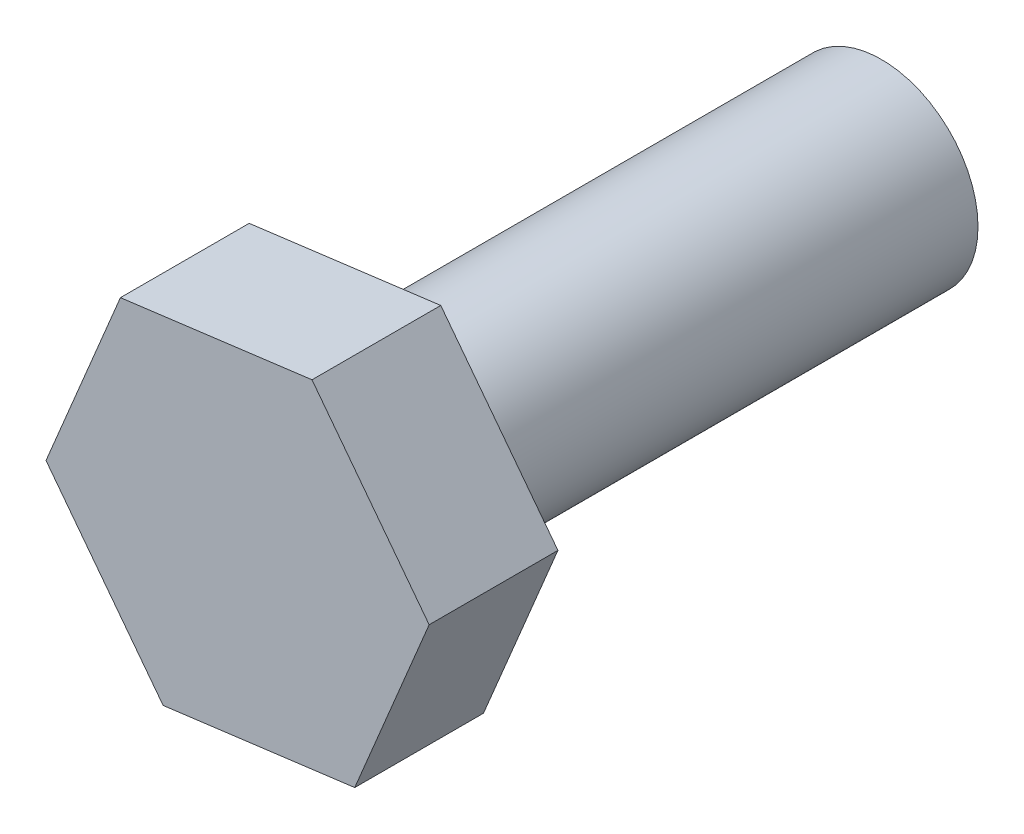
ISO-10303-21;
HEADER;
FILE_DESCRIPTION(('STEP AP214'),'2;1');
FILE_NAME('part.step','',(''),(''),'','','');
FILE_SCHEMA(('AUTOMOTIVE_DESIGN { 1 0 10303 214 1 1 1 1 }'));
ENDSEC;
DATA;
#1=APPLICATION_CONTEXT('core data for automotive mechanical design processes');
#2=APPLICATION_PROTOCOL_DEFINITION('international standard','automotive_design',2000,#1);
#3=PRODUCT_CONTEXT('',#1,'mechanical');
#4=PRODUCT('Part','Part','',(#3));
#5=PRODUCT_RELATED_PRODUCT_CATEGORY('part','',(#4));
#6=PRODUCT_DEFINITION_FORMATION('','',#4);
#7=PRODUCT_DEFINITION_CONTEXT('part definition',#1,'design');
#8=PRODUCT_DEFINITION('design','',#6,#7);
#9=PRODUCT_DEFINITION_SHAPE('','',#8);
#10=(LENGTH_UNIT() NAMED_UNIT(*) SI_UNIT(.MILLI.,.METRE.));
#11=(NAMED_UNIT(*) PLANE_ANGLE_UNIT() SI_UNIT($,.RADIAN.));
#12=(NAMED_UNIT(*) SI_UNIT($,.STERADIAN.) SOLID_ANGLE_UNIT());
#13=UNCERTAINTY_MEASURE_WITH_UNIT(LENGTH_MEASURE(1.E-05),#10,'distance_accuracy_value','');
#14=(GEOMETRIC_REPRESENTATION_CONTEXT(3) GLOBAL_UNCERTAINTY_ASSIGNED_CONTEXT((#13)) GLOBAL_UNIT_ASSIGNED_CONTEXT((#10,
#11,#12)) REPRESENTATION_CONTEXT('',''));
#15=CARTESIAN_POINT('',(0.,0.,0.));
#16=DIRECTION('',(0.,0.,1.));
#17=DIRECTION('',(1.,0.,0.));
#18=AXIS2_PLACEMENT_3D('',#15,#16,#17);
#19=CARTESIAN_POINT('',(0.,0.,-12.7));
#20=DIRECTION('',(0.,0.,1.));
#21=DIRECTION('',(1.,0.,0.));
#22=AXIS2_PLACEMENT_3D('',#19,#20,#21);
#23=CYLINDRICAL_SURFACE('',#22,2.38125);
#24=CARTESIAN_POINT('',(0.,0.,-12.7));
#25=DIRECTION('',(0.,0.,1.));
#26=DIRECTION('',(1.,0.,0.));
#27=AXIS2_PLACEMENT_3D('',#24,#25,#26);
#28=CIRCLE('',#27,2.38125);
#29=CARTESIAN_POINT('',(2.38125,0.,-12.7));
#30=VERTEX_POINT('',#29);
#31=EDGE_CURVE('E11',#30,#30,#28,.T.);
#32=ORIENTED_EDGE('',*,*,#31,.T.);
#33=EDGE_LOOP('',(#32));
#34=FACE_BOUND('',#33,.T.);
#35=CARTESIAN_POINT('',(0.,0.,0.));
#36=DIRECTION('',(0.,0.,1.));
#37=DIRECTION('',(1.,0.,0.));
#38=AXIS2_PLACEMENT_3D('',#35,#36,#37);
#39=CIRCLE('',#38,2.38125);
#40=CARTESIAN_POINT('',(2.38125,0.,0.));
#41=VERTEX_POINT('',#40);
#42=EDGE_CURVE('E36',#41,#41,#39,.T.);
#43=ORIENTED_EDGE('',*,*,#42,.F.);
#44=EDGE_LOOP('',(#43));
#45=FACE_BOUND('',#44,.T.);
#46=ADVANCED_FACE('F33',(#34,#45),#23,.T.);
#47=CARTESIAN_POINT('',(0.,0.,-12.7));
#48=DIRECTION('',(0.,0.,1.));
#49=DIRECTION('',(1.,0.,0.));
#50=AXIS2_PLACEMENT_3D('',#47,#48,#49);
#51=PLANE('',#50);
#52=ORIENTED_EDGE('',*,*,#31,.F.);
#53=EDGE_LOOP('',(#52));
#54=FACE_BOUND('',#53,.T.);
#55=ADVANCED_FACE('F144',(#54),#51,.F.);
#56=CARTESIAN_POINT('',(4.72351218179401,0.608143830391773,3.175));
#57=DIRECTION('',(-0.795088636078318,-0.606493248749828,0.));
#58=DIRECTION('',(0.606493248749828,-0.795088636078318,0.));
#59=AXIS2_PLACEMENT_3D('',#56,#57,#58);
#60=PLANE('',#59);
#61=DIRECTION('',(-0.606493248749828,0.795088636078318,0.));
#62=VECTOR('',#61,1.);
#63=CARTESIAN_POINT('',(4.72351218179401,0.608143830391773,0.));
#64=LINE('',#63,#62);
#65=CARTESIAN_POINT('',(4.72351218179401,0.608143830391773,0.));
#66=VERTEX_POINT('',#65);
#67=CARTESIAN_POINT('',(1.83508808462296,4.39475345971476,0.));
#68=VERTEX_POINT('',#67);
#69=EDGE_CURVE('E118',#66,#68,#64,.T.);
#70=ORIENTED_EDGE('',*,*,#69,.T.);
#71=DIRECTION('',(0.,0.,-1.));
#72=VECTOR('',#71,1.);
#73=CARTESIAN_POINT('',(1.83508808462296,4.39475345971476,3.175));
#74=LINE('',#73,#72);
#75=CARTESIAN_POINT('',(1.83508808462296,4.39475345971476,3.175));
#76=VERTEX_POINT('',#75);
#77=EDGE_CURVE('E135',#76,#68,#74,.T.);
#78=ORIENTED_EDGE('',*,*,#77,.F.);
#79=DIRECTION('',(-0.606493248749828,0.795088636078318,0.));
#80=VECTOR('',#79,1.);
#81=CARTESIAN_POINT('',(4.72351218179401,0.608143830391773,3.175));
#82=LINE('',#81,#80);
#83=CARTESIAN_POINT('',(4.72351218179401,0.608143830391773,3.175));
#84=VERTEX_POINT('',#83);
#85=EDGE_CURVE('E128',#84,#76,#82,.T.);
#86=ORIENTED_EDGE('',*,*,#85,.F.);
#87=DIRECTION('',(0.,0.,-1.));
#88=VECTOR('',#87,1.);
#89=CARTESIAN_POINT('',(4.72351218179401,0.608143830391773,3.175));
#90=LINE('',#89,#88);
#91=EDGE_CURVE('E114',#84,#66,#90,.T.);
#92=ORIENTED_EDGE('',*,*,#91,.T.);
#93=EDGE_LOOP('',(#70,#78,#86,#92));
#94=FACE_BOUND('',#93,.T.);
#95=ADVANCED_FACE('F149',(#94),#60,.F.);
#96=CARTESIAN_POINT('',(1.83508808462296,4.39475345971476,3.175));
#97=DIRECTION('',(0.127694242601947,-0.991813581479058,0.));
#98=DIRECTION('',(0.991813581479058,0.127694242601947,0.));
#99=AXIS2_PLACEMENT_3D('',#96,#97,#98);
#100=PLANE('',#99);
#101=DIRECTION('',(-0.991813581479058,-0.127694242601947,0.));
#102=VECTOR('',#101,1.);
#103=CARTESIAN_POINT('',(1.83508808462296,4.39475345971476,0.));
#104=LINE('',#103,#102);
#105=CARTESIAN_POINT('',(-2.88842409717106,3.78660962932299,0.));
#106=VERTEX_POINT('',#105);
#107=EDGE_CURVE('E121',#68,#106,#104,.T.);
#108=ORIENTED_EDGE('',*,*,#107,.T.);
#109=DIRECTION('',(0.,0.,-1.));
#110=VECTOR('',#109,1.);
#111=CARTESIAN_POINT('',(-2.88842409717106,3.78660962932299,3.175));
#112=LINE('',#111,#110);
#113=CARTESIAN_POINT('',(-2.88842409717106,3.78660962932299,3.175));
#114=VERTEX_POINT('',#113);
#115=EDGE_CURVE('E132',#114,#106,#112,.T.);
#116=ORIENTED_EDGE('',*,*,#115,.F.);
#117=DIRECTION('',(-0.991813581479058,-0.127694242601947,0.));
#118=VECTOR('',#117,1.);
#119=CARTESIAN_POINT('',(1.83508808462296,4.39475345971476,3.175));
#120=LINE('',#119,#118);
#121=EDGE_CURVE('E87',#76,#114,#120,.T.);
#122=ORIENTED_EDGE('',*,*,#121,.F.);
#123=ORIENTED_EDGE('',*,*,#77,.T.);
#124=EDGE_LOOP('',(#108,#116,#122,#123));
#125=FACE_BOUND('',#124,.T.);
#126=ADVANCED_FACE('F155',(#125),#100,.F.);
#127=CARTESIAN_POINT('',(-2.88842409717106,3.78660962932299,3.175));
#128=DIRECTION('',(0.922782878680265,-0.385320332729229,0.));
#129=DIRECTION('',(0.385320332729229,0.922782878680265,0.));
#130=AXIS2_PLACEMENT_3D('',#127,#128,#129);
#131=PLANE('',#130);
#132=DIRECTION('',(-0.385320332729229,-0.922782878680265,0.));
#133=VECTOR('',#132,1.);
#134=CARTESIAN_POINT('',(-2.88842409717106,3.78660962932299,0.));
#135=LINE('',#134,#133);
#136=CARTESIAN_POINT('',(-4.72351218179401,-0.608143830391774,0.));
#137=VERTEX_POINT('',#136);
#138=EDGE_CURVE('E123',#106,#137,#135,.T.);
#139=ORIENTED_EDGE('',*,*,#138,.T.);
#140=DIRECTION('',(0.,0.,-1.));
#141=VECTOR('',#140,1.);
#142=CARTESIAN_POINT('',(-4.72351218179401,-0.608143830391774,3.175));
#143=LINE('',#142,#141);
#144=CARTESIAN_POINT('',(-4.72351218179401,-0.608143830391774,3.175));
#145=VERTEX_POINT('',#144);
#146=EDGE_CURVE('E109',#145,#137,#143,.T.);
#147=ORIENTED_EDGE('',*,*,#146,.F.);
#148=DIRECTION('',(-0.385320332729229,-0.922782878680265,0.));
#149=VECTOR('',#148,1.);
#150=CARTESIAN_POINT('',(-2.88842409717106,3.78660962932299,3.175));
#151=LINE('',#150,#149);
#152=EDGE_CURVE('E100',#114,#145,#151,.T.);
#153=ORIENTED_EDGE('',*,*,#152,.F.);
#154=ORIENTED_EDGE('',*,*,#115,.T.);
#155=EDGE_LOOP('',(#139,#147,#153,#154));
#156=FACE_BOUND('',#155,.T.);
#157=ADVANCED_FACE('F161',(#156),#131,.F.);
#158=CARTESIAN_POINT('',(-4.72351218179401,-0.608143830391774,3.175));
#159=DIRECTION('',(0.795088636078317,0.606493248749828,0.));
#160=DIRECTION('',(-0.606493248749828,0.795088636078317,0.));
#161=AXIS2_PLACEMENT_3D('',#158,#159,#160);
#162=PLANE('',#161);
#163=DIRECTION('',(0.606493248749828,-0.795088636078317,0.));
#164=VECTOR('',#163,1.);
#165=CARTESIAN_POINT('',(-4.72351218179401,-0.608143830391774,0.));
#166=LINE('',#165,#164);
#167=CARTESIAN_POINT('',(-1.83508808462295,-4.39475345971476,0.));
#168=VERTEX_POINT('',#167);
#169=EDGE_CURVE('E108',#137,#168,#166,.T.);
#170=ORIENTED_EDGE('',*,*,#169,.T.);
#171=DIRECTION('',(0.,0.,-1.));
#172=VECTOR('',#171,1.);
#173=CARTESIAN_POINT('',(-1.83508808462295,-4.39475345971476,3.175));
#174=LINE('',#173,#172);
#175=CARTESIAN_POINT('',(-1.83508808462295,-4.39475345971476,3.175));
#176=VERTEX_POINT('',#175);
#177=EDGE_CURVE('E105',#176,#168,#174,.T.);
#178=ORIENTED_EDGE('',*,*,#177,.F.);
#179=DIRECTION('',(0.606493248749828,-0.795088636078317,0.));
#180=VECTOR('',#179,1.);
#181=CARTESIAN_POINT('',(-4.72351218179401,-0.608143830391774,3.175));
#182=LINE('',#181,#180);
#183=EDGE_CURVE('E94',#145,#176,#182,.T.);
#184=ORIENTED_EDGE('',*,*,#183,.F.);
#185=ORIENTED_EDGE('',*,*,#146,.T.);
#186=EDGE_LOOP('',(#170,#178,#184,#185));
#187=FACE_BOUND('',#186,.T.);
#188=ADVANCED_FACE('F106',(#187),#162,.F.);
#189=CARTESIAN_POINT('',(-1.83508808462295,-4.39475345971476,3.175));
#190=DIRECTION('',(-0.127694242601947,0.991813581479058,0.));
#191=DIRECTION('',(-0.991813581479058,-0.127694242601947,0.));
#192=AXIS2_PLACEMENT_3D('',#189,#190,#191);
#193=PLANE('',#192);
#194=DIRECTION('',(0.991813581479058,0.127694242601947,0.));
#195=VECTOR('',#194,1.);
#196=CARTESIAN_POINT('',(-1.83508808462295,-4.39475345971476,0.));
#197=LINE('',#196,#195);
#198=CARTESIAN_POINT('',(2.88842409717105,-3.78660962932299,0.));
#199=VERTEX_POINT('',#198);
#200=EDGE_CURVE('E72',#168,#199,#197,.T.);
#201=ORIENTED_EDGE('',*,*,#200,.T.);
#202=DIRECTION('',(0.,0.,-1.));
#203=VECTOR('',#202,1.);
#204=CARTESIAN_POINT('',(2.88842409717105,-3.78660962932299,3.175));
#205=LINE('',#204,#203);
#206=CARTESIAN_POINT('',(2.88842409717105,-3.78660962932299,3.175));
#207=VERTEX_POINT('',#206);
#208=EDGE_CURVE('E110',#207,#199,#205,.T.);
#209=ORIENTED_EDGE('',*,*,#208,.F.);
#210=DIRECTION('',(0.991813581479058,0.127694242601947,0.));
#211=VECTOR('',#210,1.);
#212=CARTESIAN_POINT('',(-1.83508808462295,-4.39475345971476,3.175));
#213=LINE('',#212,#211);
#214=EDGE_CURVE('E98',#176,#207,#213,.T.);
#215=ORIENTED_EDGE('',*,*,#214,.F.);
#216=ORIENTED_EDGE('',*,*,#177,.T.);
#217=EDGE_LOOP('',(#201,#209,#215,#216));
#218=FACE_BOUND('',#217,.T.);
#219=ADVANCED_FACE('F112',(#218),#193,.F.);
#220=CARTESIAN_POINT('',(2.88842409717105,-3.78660962932299,3.175));
#221=DIRECTION('',(-0.922782878680264,0.38532033272923,0.));
#222=DIRECTION('',(-0.38532033272923,-0.922782878680264,0.));
#223=AXIS2_PLACEMENT_3D('',#220,#221,#222);
#224=PLANE('',#223);
#225=DIRECTION('',(0.38532033272923,0.922782878680264,0.));
#226=VECTOR('',#225,1.);
#227=CARTESIAN_POINT('',(2.88842409717105,-3.78660962932299,0.));
#228=LINE('',#227,#226);
#229=EDGE_CURVE('E78',#199,#66,#228,.T.);
#230=ORIENTED_EDGE('',*,*,#229,.T.);
#231=ORIENTED_EDGE('',*,*,#91,.F.);
#232=DIRECTION('',(0.38532033272923,0.922782878680264,0.));
#233=VECTOR('',#232,1.);
#234=CARTESIAN_POINT('',(2.88842409717105,-3.78660962932299,3.175));
#235=LINE('',#234,#233);
#236=EDGE_CURVE('E49',#207,#84,#235,.T.);
#237=ORIENTED_EDGE('',*,*,#236,.F.);
#238=ORIENTED_EDGE('',*,*,#208,.T.);
#239=EDGE_LOOP('',(#230,#231,#237,#238));
#240=FACE_BOUND('',#239,.T.);
#241=ADVANCED_FACE('F169',(#240),#224,.F.);
#242=CARTESIAN_POINT('',(1.83508808462296,4.39475345971476,3.175));
#243=DIRECTION('',(0.,0.,1.));
#244=DIRECTION('',(1.,0.,0.));
#245=AXIS2_PLACEMENT_3D('',#242,#243,#244);
#246=PLANE('',#245);
#247=ORIENTED_EDGE('',*,*,#85,.T.);
#248=ORIENTED_EDGE('',*,*,#121,.T.);
#249=ORIENTED_EDGE('',*,*,#152,.T.);
#250=ORIENTED_EDGE('',*,*,#183,.T.);
#251=ORIENTED_EDGE('',*,*,#214,.T.);
#252=ORIENTED_EDGE('',*,*,#236,.T.);
#253=EDGE_LOOP('',(#247,#248,#249,#250,#251,#252));
#254=FACE_BOUND('',#253,.T.);
#255=ADVANCED_FACE('F96',(#254),#246,.T.);
#256=CARTESIAN_POINT('',(1.83508808462296,4.39475345971476,0.));
#257=DIRECTION('',(0.,0.,1.));
#258=DIRECTION('',(1.,0.,0.));
#259=AXIS2_PLACEMENT_3D('',#256,#257,#258);
#260=PLANE('',#259);
#261=ORIENTED_EDGE('',*,*,#42,.T.);
#262=EDGE_LOOP('',(#261));
#263=FACE_BOUND('',#262,.T.);
#264=ORIENTED_EDGE('',*,*,#69,.F.);
#265=ORIENTED_EDGE('',*,*,#229,.F.);
#266=ORIENTED_EDGE('',*,*,#200,.F.);
#267=ORIENTED_EDGE('',*,*,#169,.F.);
#268=ORIENTED_EDGE('',*,*,#138,.F.);
#269=ORIENTED_EDGE('',*,*,#107,.F.);
#270=EDGE_LOOP('',(#264,#265,#266,#267,#268,#269));
#271=FACE_BOUND('',#270,.T.);
#272=ADVANCED_FACE('F140',(#263,#271),#260,.F.);
#273=CLOSED_SHELL('',(#46,#55,#95,#126,#157,#188,#219,#241,#255,#272));
#274=MANIFOLD_SOLID_BREP('B2',#273);
#275=ADVANCED_BREP_SHAPE_REPRESENTATION('',(#18,#274),#14);
#276=SHAPE_DEFINITION_REPRESENTATION(#9,#275);
ENDSEC;
END-ISO-10303-21;
